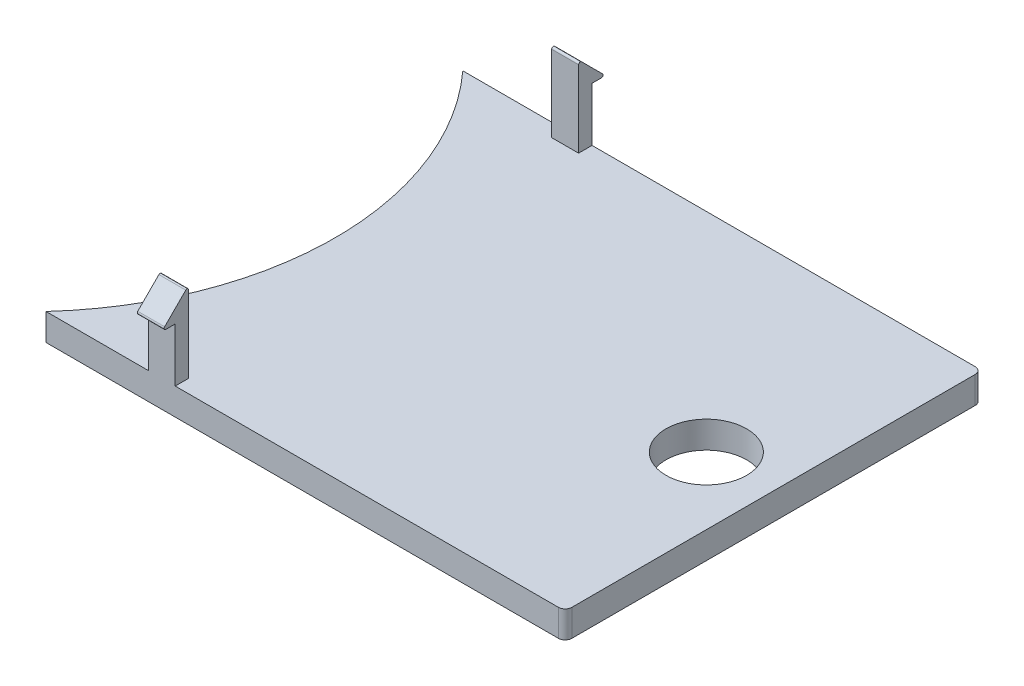
ISO-10303-21;
HEADER;
FILE_DESCRIPTION(('STEP AP214'),'2;1');
FILE_NAME('part.step','',(''),(''),'','','');
FILE_SCHEMA(('AUTOMOTIVE_DESIGN { 1 0 10303 214 1 1 1 1 }'));
ENDSEC;
DATA;
#1=APPLICATION_CONTEXT('core data for automotive mechanical design processes');
#2=APPLICATION_PROTOCOL_DEFINITION('international standard','automotive_design',2000,#1);
#3=PRODUCT_CONTEXT('',#1,'mechanical');
#4=PRODUCT('Part','Part','',(#3));
#5=PRODUCT_RELATED_PRODUCT_CATEGORY('part','',(#4));
#6=PRODUCT_DEFINITION_FORMATION('','',#4);
#7=PRODUCT_DEFINITION_CONTEXT('part definition',#1,'design');
#8=PRODUCT_DEFINITION('design','',#6,#7);
#9=PRODUCT_DEFINITION_SHAPE('','',#8);
#10=(LENGTH_UNIT() NAMED_UNIT(*) SI_UNIT(.MILLI.,.METRE.));
#11=(NAMED_UNIT(*) PLANE_ANGLE_UNIT() SI_UNIT($,.RADIAN.));
#12=(NAMED_UNIT(*) SI_UNIT($,.STERADIAN.) SOLID_ANGLE_UNIT());
#13=UNCERTAINTY_MEASURE_WITH_UNIT(LENGTH_MEASURE(1.E-05),#10,'distance_accuracy_value','');
#14=(GEOMETRIC_REPRESENTATION_CONTEXT(3) GLOBAL_UNCERTAINTY_ASSIGNED_CONTEXT((#13)) GLOBAL_UNIT_ASSIGNED_CONTEXT((#10,
#11,#12)) REPRESENTATION_CONTEXT('',''));
#15=CARTESIAN_POINT('',(0.,0.,0.));
#16=DIRECTION('',(0.,0.,1.));
#17=DIRECTION('',(1.,0.,0.));
#18=AXIS2_PLACEMENT_3D('',#15,#16,#17);
#19=CARTESIAN_POINT('',(-72.5952909359329,4.,0.));
#20=DIRECTION('',(0.,-1.,0.));
#21=DIRECTION('',(0.,0.,-1.));
#22=AXIS2_PLACEMENT_3D('',#19,#20,#21);
#23=CYLINDRICAL_SURFACE('',#22,46.);
#24=CARTESIAN_POINT('',(-72.5952909359329,0.,0.));
#25=DIRECTION('',(0.,1.,0.));
#26=DIRECTION('',(0.,0.,1.));
#27=AXIS2_PLACEMENT_3D('',#24,#25,#26);
#28=CIRCLE('',#27,46.);
#29=CARTESIAN_POINT('',(-38.61,0.,31.));
#30=VERTEX_POINT('',#29);
#31=CARTESIAN_POINT('',(-38.61,0.,-31.));
#32=VERTEX_POINT('',#31);
#33=EDGE_CURVE('E218',#30,#32,#28,.T.);
#34=ORIENTED_EDGE('',*,*,#33,.F.);
#35=DIRECTION('',(0.,-1.,0.));
#36=VECTOR('',#35,1.);
#37=CARTESIAN_POINT('',(-38.61,4.,31.));
#38=LINE('',#37,#36);
#39=CARTESIAN_POINT('',(-38.61,4.,31.));
#40=VERTEX_POINT('',#39);
#41=EDGE_CURVE('E244',#40,#30,#38,.T.);
#42=ORIENTED_EDGE('',*,*,#41,.F.);
#43=CARTESIAN_POINT('',(-72.5952909359329,4.,0.));
#44=DIRECTION('',(0.,1.,0.));
#45=DIRECTION('',(0.,0.,1.));
#46=AXIS2_PLACEMENT_3D('',#43,#44,#45);
#47=CIRCLE('',#46,46.);
#48=CARTESIAN_POINT('',(-38.61,4.,-31.));
#49=VERTEX_POINT('',#48);
#50=EDGE_CURVE('E234',#40,#49,#47,.T.);
#51=ORIENTED_EDGE('',*,*,#50,.T.);
#52=DIRECTION('',(0.,-1.,0.));
#53=VECTOR('',#52,1.);
#54=CARTESIAN_POINT('',(-38.61,4.,-31.));
#55=LINE('',#54,#53);
#56=EDGE_CURVE('E210',#49,#32,#55,.T.);
#57=ORIENTED_EDGE('',*,*,#56,.T.);
#58=EDGE_LOOP('',(#34,#42,#51,#57));
#59=FACE_BOUND('',#58,.T.);
#60=ADVANCED_FACE('F41',(#59),#23,.F.);
#61=CARTESIAN_POINT('',(0.,4.,31.));
#62=DIRECTION('',(0.,0.,-1.));
#63=DIRECTION('',(-1.,0.,0.));
#64=AXIS2_PLACEMENT_3D('',#61,#62,#63);
#65=PLANE('',#64);
#66=DIRECTION('',(1.,0.,0.));
#67=VECTOR('',#66,1.);
#68=CARTESIAN_POINT('',(0.,0.,31.));
#69=LINE('',#68,#67);
#70=CARTESIAN_POINT('',(37.61,0.,31.));
#71=VERTEX_POINT('',#70);
#72=EDGE_CURVE('E221',#30,#71,#69,.T.);
#73=ORIENTED_EDGE('',*,*,#72,.T.);
#74=DIRECTION('',(0.,-1.,0.));
#75=VECTOR('',#74,1.);
#76=CARTESIAN_POINT('',(37.61,4.,31.));
#77=LINE('',#76,#75);
#78=CARTESIAN_POINT('',(37.61,4.,31.));
#79=VERTEX_POINT('',#78);
#80=EDGE_CURVE('E241',#79,#71,#77,.T.);
#81=ORIENTED_EDGE('',*,*,#80,.F.);
#82=DIRECTION('',(1.,0.,0.));
#83=VECTOR('',#82,1.);
#84=CARTESIAN_POINT('',(0.,4.,31.));
#85=LINE('',#84,#83);
#86=CARTESIAN_POINT('',(-19.39,4.,31.));
#87=VERTEX_POINT('',#86);
#88=EDGE_CURVE('E338',#87,#79,#85,.T.);
#89=ORIENTED_EDGE('',*,*,#88,.F.);
#90=DIRECTION('',(0.,-1.,0.));
#91=VECTOR('',#90,1.);
#92=CARTESIAN_POINT('',(-19.39,4.,31.));
#93=LINE('',#92,#91);
#94=CARTESIAN_POINT('',(-19.39,12.,31.));
#95=VERTEX_POINT('',#94);
#96=EDGE_CURVE('E315',#95,#87,#93,.T.);
#97=ORIENTED_EDGE('',*,*,#96,.F.);
#98=DIRECTION('',(1.,0.,0.));
#99=VECTOR('',#98,1.);
#100=CARTESIAN_POINT('',(-23.39,12.,31.));
#101=LINE('',#100,#99);
#102=CARTESIAN_POINT('',(-23.39,12.,31.));
#103=VERTEX_POINT('',#102);
#104=EDGE_CURVE('E222',#103,#95,#101,.T.);
#105=ORIENTED_EDGE('',*,*,#104,.F.);
#106=DIRECTION('',(0.,-1.,0.));
#107=VECTOR('',#106,1.);
#108=CARTESIAN_POINT('',(-23.39,4.,31.));
#109=LINE('',#108,#107);
#110=CARTESIAN_POINT('',(-23.39,4.,31.));
#111=VERTEX_POINT('',#110);
#112=EDGE_CURVE('E328',#103,#111,#109,.T.);
#113=ORIENTED_EDGE('',*,*,#112,.T.);
#114=EDGE_CURVE('E339',#40,#111,#85,.T.);
#115=ORIENTED_EDGE('',*,*,#114,.F.);
#116=ORIENTED_EDGE('',*,*,#41,.T.);
#117=EDGE_LOOP('',(#73,#81,#89,#97,#105,#113,#115,#116));
#118=FACE_BOUND('',#117,.T.);
#119=ADVANCED_FACE('F387',(#118),#65,.F.);
#120=CARTESIAN_POINT('',(37.61,4.,30.));
#121=DIRECTION('',(0.,-1.,0.));
#122=DIRECTION('',(0.,0.,-1.));
#123=AXIS2_PLACEMENT_3D('',#120,#121,#122);
#124=CYLINDRICAL_SURFACE('',#123,1.00000000000001);
#125=CARTESIAN_POINT('',(37.61,0.,30.));
#126=DIRECTION('',(0.,1.,0.));
#127=DIRECTION('',(0.,0.,1.));
#128=AXIS2_PLACEMENT_3D('',#125,#126,#127);
#129=CIRCLE('',#128,1.00000000000001);
#130=CARTESIAN_POINT('',(38.61,0.,30.));
#131=VERTEX_POINT('',#130);
#132=EDGE_CURVE('E224',#71,#131,#129,.T.);
#133=ORIENTED_EDGE('',*,*,#132,.T.);
#134=DIRECTION('',(0.,-1.,0.));
#135=VECTOR('',#134,1.);
#136=CARTESIAN_POINT('',(38.61,4.,30.));
#137=LINE('',#136,#135);
#138=CARTESIAN_POINT('',(38.61,4.,30.));
#139=VERTEX_POINT('',#138);
#140=EDGE_CURVE('E239',#139,#131,#137,.T.);
#141=ORIENTED_EDGE('',*,*,#140,.F.);
#142=CARTESIAN_POINT('',(37.61,4.,30.));
#143=DIRECTION('',(0.,1.,0.));
#144=DIRECTION('',(0.,0.,1.));
#145=AXIS2_PLACEMENT_3D('',#142,#143,#144);
#146=CIRCLE('',#145,1.00000000000001);
#147=EDGE_CURVE('E342',#79,#139,#146,.T.);
#148=ORIENTED_EDGE('',*,*,#147,.F.);
#149=ORIENTED_EDGE('',*,*,#80,.T.);
#150=EDGE_LOOP('',(#133,#141,#148,#149));
#151=FACE_BOUND('',#150,.T.);
#152=ADVANCED_FACE('F392',(#151),#124,.T.);
#153=CARTESIAN_POINT('',(38.61,4.,0.));
#154=DIRECTION('',(1.,0.,0.));
#155=DIRECTION('',(0.,0.,-1.));
#156=AXIS2_PLACEMENT_3D('',#153,#154,#155);
#157=PLANE('',#156);
#158=DIRECTION('',(0.,0.,1.));
#159=VECTOR('',#158,1.);
#160=CARTESIAN_POINT('',(38.61,0.,0.));
#161=LINE('',#160,#159);
#162=CARTESIAN_POINT('',(38.61,0.,-30.));
#163=VERTEX_POINT('',#162);
#164=EDGE_CURVE('E227',#163,#131,#161,.T.);
#165=ORIENTED_EDGE('',*,*,#164,.F.);
#166=DIRECTION('',(0.,-1.,0.));
#167=VECTOR('',#166,1.);
#168=CARTESIAN_POINT('',(38.61,4.,-30.));
#169=LINE('',#168,#167);
#170=CARTESIAN_POINT('',(38.61,4.,-30.));
#171=VERTEX_POINT('',#170);
#172=EDGE_CURVE('E237',#171,#163,#169,.T.);
#173=ORIENTED_EDGE('',*,*,#172,.F.);
#174=DIRECTION('',(0.,0.,1.));
#175=VECTOR('',#174,1.);
#176=CARTESIAN_POINT('',(38.61,4.,0.));
#177=LINE('',#176,#175);
#178=EDGE_CURVE('E343',#171,#139,#177,.T.);
#179=ORIENTED_EDGE('',*,*,#178,.T.);
#180=ORIENTED_EDGE('',*,*,#140,.T.);
#181=EDGE_LOOP('',(#165,#173,#179,#180));
#182=FACE_BOUND('',#181,.T.);
#183=ADVANCED_FACE('F459',(#182),#157,.T.);
#184=CARTESIAN_POINT('',(37.61,4.,-30.));
#185=DIRECTION('',(0.,-1.,0.));
#186=DIRECTION('',(0.,0.,-1.));
#187=AXIS2_PLACEMENT_3D('',#184,#185,#186);
#188=CYLINDRICAL_SURFACE('',#187,1.00000000000002);
#189=CARTESIAN_POINT('',(37.61,0.,-30.));
#190=DIRECTION('',(0.,1.,0.));
#191=DIRECTION('',(0.,0.,1.));
#192=AXIS2_PLACEMENT_3D('',#189,#190,#191);
#193=CIRCLE('',#192,1.00000000000002);
#194=CARTESIAN_POINT('',(37.61,0.,-31.));
#195=VERTEX_POINT('',#194);
#196=EDGE_CURVE('E230',#195,#163,#193,.F.);
#197=ORIENTED_EDGE('',*,*,#196,.F.);
#198=DIRECTION('',(0.,-1.,0.));
#199=VECTOR('',#198,1.);
#200=CARTESIAN_POINT('',(37.61,4.,-31.));
#201=LINE('',#200,#199);
#202=CARTESIAN_POINT('',(37.61,4.,-31.));
#203=VERTEX_POINT('',#202);
#204=EDGE_CURVE('E213',#203,#195,#201,.T.);
#205=ORIENTED_EDGE('',*,*,#204,.F.);
#206=CARTESIAN_POINT('',(37.61,4.,-30.));
#207=DIRECTION('',(0.,1.,0.));
#208=DIRECTION('',(0.,0.,1.));
#209=AXIS2_PLACEMENT_3D('',#206,#207,#208);
#210=CIRCLE('',#209,1.00000000000002);
#211=EDGE_CURVE('E209',#203,#171,#210,.F.);
#212=ORIENTED_EDGE('',*,*,#211,.T.);
#213=ORIENTED_EDGE('',*,*,#172,.T.);
#214=EDGE_LOOP('',(#197,#205,#212,#213));
#215=FACE_BOUND('',#214,.T.);
#216=ADVANCED_FACE('F348',(#215),#188,.T.);
#217=CARTESIAN_POINT('',(0.,4.,-31.));
#218=DIRECTION('',(0.,0.,1.));
#219=DIRECTION('',(1.,0.,0.));
#220=AXIS2_PLACEMENT_3D('',#217,#218,#219);
#221=PLANE('',#220);
#222=DIRECTION('',(-1.,0.,0.));
#223=VECTOR('',#222,1.);
#224=CARTESIAN_POINT('',(0.,0.,-31.));
#225=LINE('',#224,#223);
#226=EDGE_CURVE('E233',#195,#32,#225,.T.);
#227=ORIENTED_EDGE('',*,*,#226,.T.);
#228=ORIENTED_EDGE('',*,*,#56,.F.);
#229=DIRECTION('',(-1.,0.,0.));
#230=VECTOR('',#229,1.);
#231=CARTESIAN_POINT('',(0.,4.,-31.));
#232=LINE('',#231,#230);
#233=CARTESIAN_POINT('',(-23.39,4.,-31.));
#234=VERTEX_POINT('',#233);
#235=EDGE_CURVE('E211',#234,#49,#232,.T.);
#236=ORIENTED_EDGE('',*,*,#235,.F.);
#237=DIRECTION('',(0.,-1.,0.));
#238=VECTOR('',#237,1.);
#239=CARTESIAN_POINT('',(-23.39,4.,-31.));
#240=LINE('',#239,#238);
#241=CARTESIAN_POINT('',(-23.39,12.,-31.));
#242=VERTEX_POINT('',#241);
#243=EDGE_CURVE('E294',#242,#234,#240,.T.);
#244=ORIENTED_EDGE('',*,*,#243,.F.);
#245=DIRECTION('',(1.,0.,0.));
#246=VECTOR('',#245,1.);
#247=CARTESIAN_POINT('',(-23.39,12.,-31.));
#248=LINE('',#247,#246);
#249=CARTESIAN_POINT('',(-19.39,12.,-31.));
#250=VERTEX_POINT('',#249);
#251=EDGE_CURVE('E202',#242,#250,#248,.T.);
#252=ORIENTED_EDGE('',*,*,#251,.T.);
#253=DIRECTION('',(0.,-1.,0.));
#254=VECTOR('',#253,1.);
#255=CARTESIAN_POINT('',(-19.39,4.,-31.));
#256=LINE('',#255,#254);
#257=CARTESIAN_POINT('',(-19.39,4.,-31.));
#258=VERTEX_POINT('',#257);
#259=EDGE_CURVE('E185',#250,#258,#256,.T.);
#260=ORIENTED_EDGE('',*,*,#259,.T.);
#261=EDGE_CURVE('E198',#203,#258,#232,.T.);
#262=ORIENTED_EDGE('',*,*,#261,.F.);
#263=ORIENTED_EDGE('',*,*,#204,.T.);
#264=EDGE_LOOP('',(#227,#228,#236,#244,#252,#260,#262,#263));
#265=FACE_BOUND('',#264,.T.);
#266=ADVANCED_FACE('F197',(#265),#221,.F.);
#267=CARTESIAN_POINT('',(0.,4.,0.));
#268=DIRECTION('',(0.,1.,0.));
#269=DIRECTION('',(0.,0.,1.));
#270=AXIS2_PLACEMENT_3D('',#267,#268,#269);
#271=PLANE('',#270);
#272=CARTESIAN_POINT('',(28.61,4.,0.));
#273=DIRECTION('',(0.,1.,0.));
#274=DIRECTION('',(0.,0.,1.));
#275=AXIS2_PLACEMENT_3D('',#272,#273,#274);
#276=CIRCLE('',#275,5.99999999999999);
#277=CARTESIAN_POINT('',(28.61,4.,5.99999999999999));
#278=VERTEX_POINT('',#277);
#279=EDGE_CURVE('E191',#278,#278,#276,.T.);
#280=ORIENTED_EDGE('',*,*,#279,.F.);
#281=EDGE_LOOP('',(#280));
#282=FACE_BOUND('',#281,.T.);
#283=DIRECTION('',(0.,0.,1.));
#284=VECTOR('',#283,1.);
#285=CARTESIAN_POINT('',(-23.39,4.,-29.));
#286=LINE('',#285,#284);
#287=CARTESIAN_POINT('',(-23.39,4.,-29.));
#288=VERTEX_POINT('',#287);
#289=EDGE_CURVE('E292',#234,#288,#286,.T.);
#290=ORIENTED_EDGE('',*,*,#289,.F.);
#291=ORIENTED_EDGE('',*,*,#235,.T.);
#292=ORIENTED_EDGE('',*,*,#50,.F.);
#293=ORIENTED_EDGE('',*,*,#114,.T.);
#294=DIRECTION('',(0.,0.,-1.));
#295=VECTOR('',#294,1.);
#296=CARTESIAN_POINT('',(-23.39,4.,29.));
#297=LINE('',#296,#295);
#298=CARTESIAN_POINT('',(-23.39,4.,29.));
#299=VERTEX_POINT('',#298);
#300=EDGE_CURVE('E317',#111,#299,#297,.T.);
#301=ORIENTED_EDGE('',*,*,#300,.T.);
#302=DIRECTION('',(1.,0.,0.));
#303=VECTOR('',#302,1.);
#304=CARTESIAN_POINT('',(-23.39,4.,29.));
#305=LINE('',#304,#303);
#306=CARTESIAN_POINT('',(-19.39,4.,29.));
#307=VERTEX_POINT('',#306);
#308=EDGE_CURVE('E331',#299,#307,#305,.T.);
#309=ORIENTED_EDGE('',*,*,#308,.T.);
#310=DIRECTION('',(0.,0.,-1.));
#311=VECTOR('',#310,1.);
#312=CARTESIAN_POINT('',(-19.39,4.,29.));
#313=LINE('',#312,#311);
#314=EDGE_CURVE('E303',#87,#307,#313,.T.);
#315=ORIENTED_EDGE('',*,*,#314,.F.);
#316=ORIENTED_EDGE('',*,*,#88,.T.);
#317=ORIENTED_EDGE('',*,*,#147,.T.);
#318=ORIENTED_EDGE('',*,*,#178,.F.);
#319=ORIENTED_EDGE('',*,*,#211,.F.);
#320=ORIENTED_EDGE('',*,*,#261,.T.);
#321=DIRECTION('',(0.,0.,1.));
#322=VECTOR('',#321,1.);
#323=CARTESIAN_POINT('',(-19.39,4.,-29.));
#324=LINE('',#323,#322);
#325=CARTESIAN_POINT('',(-19.39,4.,-29.));
#326=VERTEX_POINT('',#325);
#327=EDGE_CURVE('E180',#258,#326,#324,.T.);
#328=ORIENTED_EDGE('',*,*,#327,.T.);
#329=DIRECTION('',(1.,0.,0.));
#330=VECTOR('',#329,1.);
#331=CARTESIAN_POINT('',(-23.39,4.,-29.));
#332=LINE('',#331,#330);
#333=EDGE_CURVE('E291',#288,#326,#332,.T.);
#334=ORIENTED_EDGE('',*,*,#333,.F.);
#335=EDGE_LOOP('',(#290,#291,#292,#293,#301,#309,#315,#316,#317,#318,#319,#320,#328,#334));
#336=FACE_BOUND('',#335,.T.);
#337=ADVANCED_FACE('F206',(#282,#336),#271,.T.);
#338=CARTESIAN_POINT('',(0.,0.,0.));
#339=DIRECTION('',(0.,1.,0.));
#340=DIRECTION('',(0.,0.,1.));
#341=AXIS2_PLACEMENT_3D('',#338,#339,#340);
#342=PLANE('',#341);
#343=CARTESIAN_POINT('',(28.61,0.,0.));
#344=DIRECTION('',(0.,-1.,0.));
#345=DIRECTION('',(0.,0.,-1.));
#346=AXIS2_PLACEMENT_3D('',#343,#344,#345);
#347=CIRCLE('',#346,5.99999999999999);
#348=CARTESIAN_POINT('',(28.61,0.,-5.99999999999999));
#349=VERTEX_POINT('',#348);
#350=EDGE_CURVE('E367',#349,#349,#347,.T.);
#351=ORIENTED_EDGE('',*,*,#350,.F.);
#352=EDGE_LOOP('',(#351));
#353=FACE_BOUND('',#352,.T.);
#354=ORIENTED_EDGE('',*,*,#33,.T.);
#355=ORIENTED_EDGE('',*,*,#226,.F.);
#356=ORIENTED_EDGE('',*,*,#196,.T.);
#357=ORIENTED_EDGE('',*,*,#164,.T.);
#358=ORIENTED_EDGE('',*,*,#132,.F.);
#359=ORIENTED_EDGE('',*,*,#72,.F.);
#360=EDGE_LOOP('',(#354,#355,#356,#357,#358,#359));
#361=FACE_BOUND('',#360,.T.);
#362=ADVANCED_FACE('F353',(#353,#361),#342,.F.);
#363=CARTESIAN_POINT('',(-23.39,12.,31.));
#364=DIRECTION('',(0.,-1.,0.));
#365=DIRECTION('',(0.,0.,-1.));
#366=AXIS2_PLACEMENT_3D('',#363,#364,#365);
#367=PLANE('',#366);
#368=DIRECTION('',(0.,0.,-1.));
#369=VECTOR('',#368,1.);
#370=CARTESIAN_POINT('',(-19.39,12.,31.));
#371=LINE('',#370,#369);
#372=CARTESIAN_POINT('',(-19.39,12.,32.3964466094067));
#373=VERTEX_POINT('',#372);
#374=EDGE_CURVE('E313',#373,#95,#371,.T.);
#375=ORIENTED_EDGE('',*,*,#374,.F.);
#376=DIRECTION('',(1.,0.,0.));
#377=VECTOR('',#376,1.);
#378=CARTESIAN_POINT('',(-23.39,12.,32.3964466094067));
#379=LINE('',#378,#377);
#380=CARTESIAN_POINT('',(-23.39,12.,32.3964466094067));
#381=VERTEX_POINT('',#380);
#382=EDGE_CURVE('E262',#373,#381,#379,.F.);
#383=ORIENTED_EDGE('',*,*,#382,.T.);
#384=DIRECTION('',(0.,0.,-1.));
#385=VECTOR('',#384,1.);
#386=CARTESIAN_POINT('',(-23.39,12.,31.));
#387=LINE('',#386,#385);
#388=EDGE_CURVE('E326',#381,#103,#387,.T.);
#389=ORIENTED_EDGE('',*,*,#388,.T.);
#390=ORIENTED_EDGE('',*,*,#104,.T.);
#391=EDGE_LOOP('',(#375,#383,#389,#390));
#392=FACE_BOUND('',#391,.T.);
#393=ADVANCED_FACE('F374',(#392),#367,.T.);
#394=CARTESIAN_POINT('',(-23.39,12.,33.));
#395=DIRECTION('',(0.,0.707106781186548,0.707106781186547));
#396=DIRECTION('',(0.,-0.707106781186547,0.707106781186548));
#397=AXIS2_PLACEMENT_3D('',#394,#395,#396);
#398=PLANE('',#397);
#399=DIRECTION('',(0.,-0.707106781186547,0.707106781186548));
#400=VECTOR('',#399,1.);
#401=CARTESIAN_POINT('',(-19.39,12.,33.));
#402=LINE('',#401,#400);
#403=CARTESIAN_POINT('',(-19.39,15.5732233047034,29.4267766952966));
#404=VERTEX_POINT('',#403);
#405=CARTESIAN_POINT('',(-19.39,12.4267766952966,32.5732233047034));
#406=VERTEX_POINT('',#405);
#407=EDGE_CURVE('E310',#404,#406,#402,.T.);
#408=ORIENTED_EDGE('',*,*,#407,.F.);
#409=DIRECTION('',(1.,0.,0.));
#410=VECTOR('',#409,1.);
#411=CARTESIAN_POINT('',(-23.39,15.5732233047034,29.4267766952966));
#412=LINE('',#411,#410);
#413=CARTESIAN_POINT('',(-23.39,15.5732233047034,29.4267766952966));
#414=VERTEX_POINT('',#413);
#415=EDGE_CURVE('E256',#404,#414,#412,.F.);
#416=ORIENTED_EDGE('',*,*,#415,.T.);
#417=DIRECTION('',(0.,-0.707106781186547,0.707106781186548));
#418=VECTOR('',#417,1.);
#419=CARTESIAN_POINT('',(-23.39,12.,33.));
#420=LINE('',#419,#418);
#421=CARTESIAN_POINT('',(-23.39,12.4267766952966,32.5732233047034));
#422=VERTEX_POINT('',#421);
#423=EDGE_CURVE('E323',#414,#422,#420,.T.);
#424=ORIENTED_EDGE('',*,*,#423,.T.);
#425=DIRECTION('',(1.,0.,0.));
#426=VECTOR('',#425,1.);
#427=CARTESIAN_POINT('',(-23.39,12.4267766952966,32.5732233047034));
#428=LINE('',#427,#426);
#429=EDGE_CURVE('E253',#422,#406,#428,.T.);
#430=ORIENTED_EDGE('',*,*,#429,.T.);
#431=EDGE_LOOP('',(#408,#416,#424,#430));
#432=FACE_BOUND('',#431,.T.);
#433=ADVANCED_FACE('F380',(#432),#398,.T.);
#434=CARTESIAN_POINT('',(-23.39,16.,29.));
#435=DIRECTION('',(0.,0.,-1.));
#436=DIRECTION('',(-1.,0.,0.));
#437=AXIS2_PLACEMENT_3D('',#434,#435,#436);
#438=PLANE('',#437);
#439=DIRECTION('',(0.,1.,0.));
#440=VECTOR('',#439,1.);
#441=CARTESIAN_POINT('',(-23.39,16.,29.));
#442=LINE('',#441,#440);
#443=CARTESIAN_POINT('',(-23.39,15.3964466094067,29.));
#444=VERTEX_POINT('',#443);
#445=EDGE_CURVE('E320',#299,#444,#442,.T.);
#446=ORIENTED_EDGE('',*,*,#445,.T.);
#447=DIRECTION('',(1.,0.,0.));
#448=VECTOR('',#447,1.);
#449=CARTESIAN_POINT('',(-23.39,15.3964466094067,29.));
#450=LINE('',#449,#448);
#451=CARTESIAN_POINT('',(-19.39,15.3964466094067,29.));
#452=VERTEX_POINT('',#451);
#453=EDGE_CURVE('E246',#444,#452,#450,.T.);
#454=ORIENTED_EDGE('',*,*,#453,.T.);
#455=DIRECTION('',(0.,1.,0.));
#456=VECTOR('',#455,1.);
#457=CARTESIAN_POINT('',(-19.39,16.,29.));
#458=LINE('',#457,#456);
#459=EDGE_CURVE('E307',#307,#452,#458,.T.);
#460=ORIENTED_EDGE('',*,*,#459,.F.);
#461=ORIENTED_EDGE('',*,*,#308,.F.);
#462=EDGE_LOOP('',(#446,#454,#460,#461));
#463=FACE_BOUND('',#462,.T.);
#464=ADVANCED_FACE('F429',(#463),#438,.T.);
#465=CARTESIAN_POINT('',(-23.39,0.,0.));
#466=DIRECTION('',(-1.,0.,0.));
#467=DIRECTION('',(0.,0.,1.));
#468=AXIS2_PLACEMENT_3D('',#465,#466,#467);
#469=PLANE('',#468);
#470=ORIENTED_EDGE('',*,*,#423,.F.);
#471=CARTESIAN_POINT('',(-23.39,15.3964466094067,29.25));
#472=DIRECTION('',(-1.,0.,0.));
#473=DIRECTION('',(0.,0.,1.));
#474=AXIS2_PLACEMENT_3D('',#471,#472,#473);
#475=CIRCLE('',#474,0.25);
#476=EDGE_CURVE('E260',#414,#444,#475,.T.);
#477=ORIENTED_EDGE('',*,*,#476,.T.);
#478=ORIENTED_EDGE('',*,*,#445,.F.);
#479=ORIENTED_EDGE('',*,*,#300,.F.);
#480=ORIENTED_EDGE('',*,*,#112,.F.);
#481=ORIENTED_EDGE('',*,*,#388,.F.);
#482=CARTESIAN_POINT('',(-23.39,12.25,32.3964466094067));
#483=DIRECTION('',(-1.,0.,0.));
#484=DIRECTION('',(0.,0.,1.));
#485=AXIS2_PLACEMENT_3D('',#482,#483,#484);
#486=CIRCLE('',#485,0.25);
#487=EDGE_CURVE('E258',#381,#422,#486,.T.);
#488=ORIENTED_EDGE('',*,*,#487,.T.);
#489=EDGE_LOOP('',(#470,#477,#478,#479,#480,#481,#488));
#490=FACE_BOUND('',#489,.T.);
#491=ADVANCED_FACE('F426',(#490),#469,.T.);
#492=CARTESIAN_POINT('',(-19.39,0.,0.));
#493=DIRECTION('',(-1.,0.,0.));
#494=DIRECTION('',(0.,0.,1.));
#495=AXIS2_PLACEMENT_3D('',#492,#493,#494);
#496=PLANE('',#495);
#497=ORIENTED_EDGE('',*,*,#459,.T.);
#498=CARTESIAN_POINT('',(-19.39,15.3964466094067,29.25));
#499=DIRECTION('',(-1.,0.,0.));
#500=DIRECTION('',(0.,0.,1.));
#501=AXIS2_PLACEMENT_3D('',#498,#499,#500);
#502=CIRCLE('',#501,0.25);
#503=EDGE_CURVE('E251',#452,#404,#502,.F.);
#504=ORIENTED_EDGE('',*,*,#503,.T.);
#505=ORIENTED_EDGE('',*,*,#407,.T.);
#506=CARTESIAN_POINT('',(-19.39,12.25,32.3964466094067));
#507=DIRECTION('',(-1.,0.,0.));
#508=DIRECTION('',(0.,0.,1.));
#509=AXIS2_PLACEMENT_3D('',#506,#507,#508);
#510=CIRCLE('',#509,0.25);
#511=EDGE_CURVE('E249',#406,#373,#510,.F.);
#512=ORIENTED_EDGE('',*,*,#511,.T.);
#513=ORIENTED_EDGE('',*,*,#374,.T.);
#514=ORIENTED_EDGE('',*,*,#96,.T.);
#515=ORIENTED_EDGE('',*,*,#314,.T.);
#516=EDGE_LOOP('',(#497,#504,#505,#512,#513,#514,#515));
#517=FACE_BOUND('',#516,.T.);
#518=ADVANCED_FACE('F401',(#517),#496,.F.);
#519=CARTESIAN_POINT('',(-23.39,15.3964466094067,29.25));
#520=DIRECTION('',(1.,0.,0.));
#521=DIRECTION('',(0.,0.,-1.));
#522=AXIS2_PLACEMENT_3D('',#519,#520,#521);
#523=CYLINDRICAL_SURFACE('',#522,0.25);
#524=ORIENTED_EDGE('',*,*,#476,.F.);
#525=ORIENTED_EDGE('',*,*,#415,.F.);
#526=ORIENTED_EDGE('',*,*,#503,.F.);
#527=ORIENTED_EDGE('',*,*,#453,.F.);
#528=EDGE_LOOP('',(#524,#525,#526,#527));
#529=FACE_BOUND('',#528,.T.);
#530=ADVANCED_FACE('F397',(#529),#523,.T.);
#531=CARTESIAN_POINT('',(-23.39,12.25,32.3964466094067));
#532=DIRECTION('',(1.,0.,0.));
#533=DIRECTION('',(0.,0.,-1.));
#534=AXIS2_PLACEMENT_3D('',#531,#532,#533);
#535=CYLINDRICAL_SURFACE('',#534,0.25);
#536=ORIENTED_EDGE('',*,*,#487,.F.);
#537=ORIENTED_EDGE('',*,*,#382,.F.);
#538=ORIENTED_EDGE('',*,*,#511,.F.);
#539=ORIENTED_EDGE('',*,*,#429,.F.);
#540=EDGE_LOOP('',(#536,#537,#538,#539));
#541=FACE_BOUND('',#540,.T.);
#542=ADVANCED_FACE('F400',(#541),#535,.T.);
#543=CARTESIAN_POINT('',(-23.39,16.,-29.));
#544=DIRECTION('',(0.,0.,-1.));
#545=DIRECTION('',(-1.,0.,0.));
#546=AXIS2_PLACEMENT_3D('',#543,#544,#545);
#547=PLANE('',#546);
#548=DIRECTION('',(0.,1.,0.));
#549=VECTOR('',#548,1.);
#550=CARTESIAN_POINT('',(-19.39,16.,-29.));
#551=LINE('',#550,#549);
#552=CARTESIAN_POINT('',(-19.39,15.3964466094067,-29.));
#553=VERTEX_POINT('',#552);
#554=EDGE_CURVE('E186',#326,#553,#551,.T.);
#555=ORIENTED_EDGE('',*,*,#554,.T.);
#556=DIRECTION('',(1.,0.,0.));
#557=VECTOR('',#556,1.);
#558=CARTESIAN_POINT('',(-23.39,15.3964466094067,-29.));
#559=LINE('',#558,#557);
#560=CARTESIAN_POINT('',(-23.39,15.3964466094067,-29.));
#561=VERTEX_POINT('',#560);
#562=EDGE_CURVE('E64',#553,#561,#559,.F.);
#563=ORIENTED_EDGE('',*,*,#562,.T.);
#564=DIRECTION('',(0.,1.,0.));
#565=VECTOR('',#564,1.);
#566=CARTESIAN_POINT('',(-23.39,16.,-29.));
#567=LINE('',#566,#565);
#568=EDGE_CURVE('E279',#288,#561,#567,.T.);
#569=ORIENTED_EDGE('',*,*,#568,.F.);
#570=ORIENTED_EDGE('',*,*,#333,.T.);
#571=EDGE_LOOP('',(#555,#563,#569,#570));
#572=FACE_BOUND('',#571,.T.);
#573=ADVANCED_FACE('F290',(#572),#547,.F.);
#574=CARTESIAN_POINT('',(-23.39,12.,-33.));
#575=DIRECTION('',(0.,-0.707106781186548,0.707106781186547));
#576=DIRECTION('',(0.,-0.707106781186547,-0.707106781186548));
#577=AXIS2_PLACEMENT_3D('',#574,#575,#576);
#578=PLANE('',#577);
#579=DIRECTION('',(0.,-0.707106781186547,-0.707106781186548));
#580=VECTOR('',#579,1.);
#581=CARTESIAN_POINT('',(-23.39,12.,-33.));
#582=LINE('',#581,#580);
#583=CARTESIAN_POINT('',(-23.39,15.5732233047034,-29.4267766952966));
#584=VERTEX_POINT('',#583);
#585=CARTESIAN_POINT('',(-23.39,12.4267766952966,-32.5732233047034));
#586=VERTEX_POINT('',#585);
#587=EDGE_CURVE('E277',#584,#586,#582,.T.);
#588=ORIENTED_EDGE('',*,*,#587,.F.);
#589=DIRECTION('',(1.,0.,0.));
#590=VECTOR('',#589,1.);
#591=CARTESIAN_POINT('',(-23.39,15.5732233047034,-29.4267766952966));
#592=LINE('',#591,#590);
#593=CARTESIAN_POINT('',(-19.39,15.5732233047034,-29.4267766952966));
#594=VERTEX_POINT('',#593);
#595=EDGE_CURVE('E266',#584,#594,#592,.T.);
#596=ORIENTED_EDGE('',*,*,#595,.T.);
#597=DIRECTION('',(0.,-0.707106781186547,-0.707106781186548));
#598=VECTOR('',#597,1.);
#599=CARTESIAN_POINT('',(-19.39,12.,-33.));
#600=LINE('',#599,#598);
#601=CARTESIAN_POINT('',(-19.39,12.4267766952966,-32.5732233047034));
#602=VERTEX_POINT('',#601);
#603=EDGE_CURVE('E289',#594,#602,#600,.T.);
#604=ORIENTED_EDGE('',*,*,#603,.T.);
#605=DIRECTION('',(1.,0.,0.));
#606=VECTOR('',#605,1.);
#607=CARTESIAN_POINT('',(-23.39,12.4267766952966,-32.5732233047034));
#608=LINE('',#607,#606);
#609=EDGE_CURVE('E264',#602,#586,#608,.F.);
#610=ORIENTED_EDGE('',*,*,#609,.T.);
#611=EDGE_LOOP('',(#588,#596,#604,#610));
#612=FACE_BOUND('',#611,.T.);
#613=ADVANCED_FACE('F283',(#612),#578,.F.);
#614=CARTESIAN_POINT('',(-23.39,12.,-31.));
#615=DIRECTION('',(0.,1.,0.));
#616=DIRECTION('',(0.,0.,1.));
#617=AXIS2_PLACEMENT_3D('',#614,#615,#616);
#618=PLANE('',#617);
#619=DIRECTION('',(0.,0.,1.));
#620=VECTOR('',#619,1.);
#621=CARTESIAN_POINT('',(-23.39,12.,-31.));
#622=LINE('',#621,#620);
#623=CARTESIAN_POINT('',(-23.39,12.,-32.3964466094067));
#624=VERTEX_POINT('',#623);
#625=EDGE_CURVE('E286',#624,#242,#622,.T.);
#626=ORIENTED_EDGE('',*,*,#625,.F.);
#627=DIRECTION('',(1.,0.,0.));
#628=VECTOR('',#627,1.);
#629=CARTESIAN_POINT('',(-23.39,12.,-32.3964466094067));
#630=LINE('',#629,#628);
#631=CARTESIAN_POINT('',(-19.39,12.,-32.3964466094067));
#632=VERTEX_POINT('',#631);
#633=EDGE_CURVE('E11',#624,#632,#630,.T.);
#634=ORIENTED_EDGE('',*,*,#633,.T.);
#635=DIRECTION('',(0.,0.,1.));
#636=VECTOR('',#635,1.);
#637=CARTESIAN_POINT('',(-19.39,12.,-31.));
#638=LINE('',#637,#636);
#639=EDGE_CURVE('E203',#632,#250,#638,.T.);
#640=ORIENTED_EDGE('',*,*,#639,.T.);
#641=ORIENTED_EDGE('',*,*,#251,.F.);
#642=EDGE_LOOP('',(#626,#634,#640,#641));
#643=FACE_BOUND('',#642,.T.);
#644=ADVANCED_FACE('F363',(#643),#618,.F.);
#645=CARTESIAN_POINT('',(-23.39,0.,0.));
#646=DIRECTION('',(-1.,0.,0.));
#647=DIRECTION('',(0.,0.,-1.));
#648=AXIS2_PLACEMENT_3D('',#645,#646,#647);
#649=PLANE('',#648);
#650=ORIENTED_EDGE('',*,*,#568,.T.);
#651=CARTESIAN_POINT('',(-23.39,15.3964466094067,-29.25));
#652=DIRECTION('',(-1.,0.,0.));
#653=DIRECTION('',(0.,0.,1.));
#654=AXIS2_PLACEMENT_3D('',#651,#652,#653);
#655=CIRCLE('',#654,0.25);
#656=EDGE_CURVE('E49',#561,#584,#655,.T.);
#657=ORIENTED_EDGE('',*,*,#656,.T.);
#658=ORIENTED_EDGE('',*,*,#587,.T.);
#659=CARTESIAN_POINT('',(-23.39,12.25,-32.3964466094067));
#660=DIRECTION('',(-1.,0.,0.));
#661=DIRECTION('',(0.,0.,1.));
#662=AXIS2_PLACEMENT_3D('',#659,#660,#661);
#663=CIRCLE('',#662,0.25);
#664=EDGE_CURVE('E56',#586,#624,#663,.T.);
#665=ORIENTED_EDGE('',*,*,#664,.T.);
#666=ORIENTED_EDGE('',*,*,#625,.T.);
#667=ORIENTED_EDGE('',*,*,#243,.T.);
#668=ORIENTED_EDGE('',*,*,#289,.T.);
#669=EDGE_LOOP('',(#650,#657,#658,#665,#666,#667,#668));
#670=FACE_BOUND('',#669,.T.);
#671=ADVANCED_FACE('F276',(#670),#649,.T.);
#672=CARTESIAN_POINT('',(-19.39,0.,0.));
#673=DIRECTION('',(-1.,0.,0.));
#674=DIRECTION('',(0.,0.,-1.));
#675=AXIS2_PLACEMENT_3D('',#672,#673,#674);
#676=PLANE('',#675);
#677=ORIENTED_EDGE('',*,*,#603,.F.);
#678=CARTESIAN_POINT('',(-19.39,15.3964466094067,-29.25));
#679=DIRECTION('',(-1.,0.,0.));
#680=DIRECTION('',(0.,0.,1.));
#681=AXIS2_PLACEMENT_3D('',#678,#679,#680);
#682=CIRCLE('',#681,0.25);
#683=EDGE_CURVE('E271',#594,#553,#682,.F.);
#684=ORIENTED_EDGE('',*,*,#683,.T.);
#685=ORIENTED_EDGE('',*,*,#554,.F.);
#686=ORIENTED_EDGE('',*,*,#327,.F.);
#687=ORIENTED_EDGE('',*,*,#259,.F.);
#688=ORIENTED_EDGE('',*,*,#639,.F.);
#689=CARTESIAN_POINT('',(-19.39,12.25,-32.3964466094067));
#690=DIRECTION('',(-1.,0.,0.));
#691=DIRECTION('',(0.,0.,1.));
#692=AXIS2_PLACEMENT_3D('',#689,#690,#691);
#693=CIRCLE('',#692,0.25);
#694=EDGE_CURVE('E269',#632,#602,#693,.F.);
#695=ORIENTED_EDGE('',*,*,#694,.T.);
#696=EDGE_LOOP('',(#677,#684,#685,#686,#687,#688,#695));
#697=FACE_BOUND('',#696,.T.);
#698=ADVANCED_FACE('F183',(#697),#676,.F.);
#699=CARTESIAN_POINT('',(-23.39,15.3964466094067,-29.25));
#700=DIRECTION('',(1.,0.,0.));
#701=DIRECTION('',(0.,0.,-1.));
#702=AXIS2_PLACEMENT_3D('',#699,#700,#701);
#703=CYLINDRICAL_SURFACE('',#702,0.25);
#704=ORIENTED_EDGE('',*,*,#656,.F.);
#705=ORIENTED_EDGE('',*,*,#562,.F.);
#706=ORIENTED_EDGE('',*,*,#683,.F.);
#707=ORIENTED_EDGE('',*,*,#595,.F.);
#708=EDGE_LOOP('',(#704,#705,#706,#707));
#709=FACE_BOUND('',#708,.T.);
#710=ADVANCED_FACE('F288',(#709),#703,.T.);
#711=CARTESIAN_POINT('',(-23.39,12.25,-32.3964466094067));
#712=DIRECTION('',(1.,0.,0.));
#713=DIRECTION('',(0.,0.,-1.));
#714=AXIS2_PLACEMENT_3D('',#711,#712,#713);
#715=CYLINDRICAL_SURFACE('',#714,0.25);
#716=ORIENTED_EDGE('',*,*,#664,.F.);
#717=ORIENTED_EDGE('',*,*,#609,.F.);
#718=ORIENTED_EDGE('',*,*,#694,.F.);
#719=ORIENTED_EDGE('',*,*,#633,.F.);
#720=EDGE_LOOP('',(#716,#717,#718,#719));
#721=FACE_BOUND('',#720,.T.);
#722=ADVANCED_FACE('F43',(#721),#715,.T.);
#723=CARTESIAN_POINT('',(28.61,15.6464466094067,0.));
#724=DIRECTION('',(0.,-1.,0.));
#725=DIRECTION('',(0.,0.,-1.));
#726=AXIS2_PLACEMENT_3D('',#723,#724,#725);
#727=CYLINDRICAL_SURFACE('',#726,5.99999999999999);
#728=ORIENTED_EDGE('',*,*,#279,.T.);
#729=EDGE_LOOP('',(#728));
#730=FACE_BOUND('',#729,.T.);
#731=ORIENTED_EDGE('',*,*,#350,.T.);
#732=EDGE_LOOP('',(#731));
#733=FACE_BOUND('',#732,.T.);
#734=ADVANCED_FACE('F371',(#730,#733),#727,.F.);
#735=CLOSED_SHELL('',(#60,#119,#152,#183,#216,#266,#337,#362,#393,#433,#464,#491,#518,#530,#542,
#573,#613,#644,#671,#698,#710,#722,#734));
#736=MANIFOLD_SOLID_BREP('B2',#735);
#737=ADVANCED_BREP_SHAPE_REPRESENTATION('',(#18,#736),#14);
#738=SHAPE_DEFINITION_REPRESENTATION(#9,#737);
ENDSEC;
END-ISO-10303-21;
